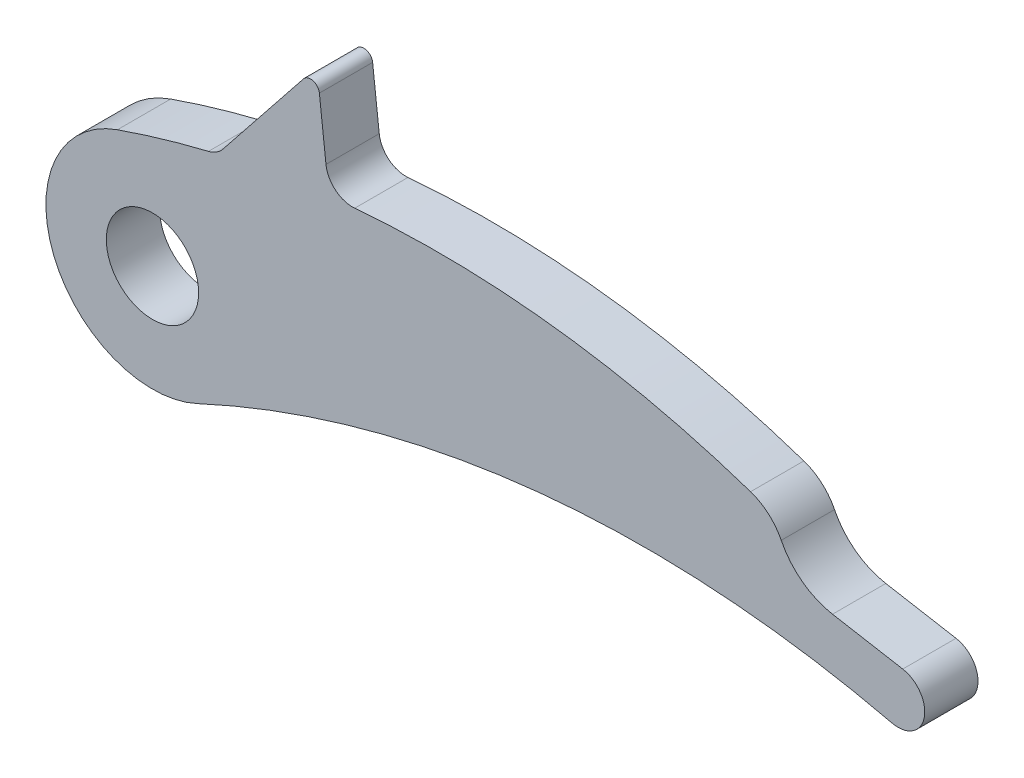
ISO-10303-21;
HEADER;
FILE_DESCRIPTION(('STEP AP214'),'2;1');
FILE_NAME('part.step','',(''),(''),'','','');
FILE_SCHEMA(('AUTOMOTIVE_DESIGN { 1 0 10303 214 1 1 1 1 }'));
ENDSEC;
DATA;
#1=APPLICATION_CONTEXT('core data for automotive mechanical design processes');
#2=APPLICATION_PROTOCOL_DEFINITION('international standard','automotive_design',2000,#1);
#3=PRODUCT_CONTEXT('',#1,'mechanical');
#4=PRODUCT('Part','Part','',(#3));
#5=PRODUCT_RELATED_PRODUCT_CATEGORY('part','',(#4));
#6=PRODUCT_DEFINITION_FORMATION('','',#4);
#7=PRODUCT_DEFINITION_CONTEXT('part definition',#1,'design');
#8=PRODUCT_DEFINITION('design','',#6,#7);
#9=PRODUCT_DEFINITION_SHAPE('','',#8);
#10=(LENGTH_UNIT() NAMED_UNIT(*) SI_UNIT(.MILLI.,.METRE.));
#11=(NAMED_UNIT(*) PLANE_ANGLE_UNIT() SI_UNIT($,.RADIAN.));
#12=(NAMED_UNIT(*) SI_UNIT($,.STERADIAN.) SOLID_ANGLE_UNIT());
#13=UNCERTAINTY_MEASURE_WITH_UNIT(LENGTH_MEASURE(1.E-05),#10,'distance_accuracy_value','');
#14=(GEOMETRIC_REPRESENTATION_CONTEXT(3) GLOBAL_UNCERTAINTY_ASSIGNED_CONTEXT((#13)) GLOBAL_UNIT_ASSIGNED_CONTEXT((#10,
#11,#12)) REPRESENTATION_CONTEXT('',''));
#15=CARTESIAN_POINT('',(0.,0.,0.));
#16=DIRECTION('',(0.,0.,1.));
#17=DIRECTION('',(1.,0.,0.));
#18=AXIS2_PLACEMENT_3D('',#15,#16,#17);
#19=CARTESIAN_POINT('',(8.90518114231674,13.0845857956096,3.));
#20=DIRECTION('',(0.,0.,1.));
#21=DIRECTION('',(1.,0.,0.));
#22=AXIS2_PLACEMENT_3D('',#19,#20,#21);
#23=PLANE('',#22);
#24=CARTESIAN_POINT('',(8.90518114231674,13.0845857956096,3.));
#25=DIRECTION('',(0.,0.,1.));
#26=DIRECTION('',(1.,0.,0.));
#27=AXIS2_PLACEMENT_3D('',#24,#25,#26);
#28=CIRCLE('',#27,0.499999999999999);
#29=CARTESIAN_POINT('',(9.40201950643126,13.1407252642925,3.));
#30=VERTEX_POINT('',#29);
#31=CARTESIAN_POINT('',(8.51416676689983,13.3962069730308,3.));
#32=VERTEX_POINT('',#31);
#33=EDGE_CURVE('E175',#30,#32,#28,.T.);
#34=ORIENTED_EDGE('',*,*,#33,.T.);
#35=DIRECTION('',(-0.623242354842235,-0.78202875083382,0.));
#36=VECTOR('',#35,1.);
#37=CARTESIAN_POINT('',(3.97449738674808,7.69994460097602,3.));
#38=LINE('',#37,#36);
#39=CARTESIAN_POINT('',(3.97449738674808,7.69994460097602,3.));
#40=VERTEX_POINT('',#39);
#41=EDGE_CURVE('E142',#32,#40,#38,.T.);
#42=ORIENTED_EDGE('',*,*,#41,.T.);
#43=CARTESIAN_POINT('',(2.80145426049735,8.63480813323937,3.));
#44=DIRECTION('',(0.,0.,-1.));
#45=DIRECTION('',(-1.,0.,0.));
#46=AXIS2_PLACEMENT_3D('',#43,#44,#45);
#47=CIRCLE('',#46,1.5);
#48=CARTESIAN_POINT('',(3.15492455497266,7.17705000826681,3.));
#49=VERTEX_POINT('',#48);
#50=EDGE_CURVE('E178',#40,#49,#47,.T.);
#51=ORIENTED_EDGE('',*,*,#50,.T.);
#52=CARTESIAN_POINT('',(16.1155020190674,-46.2740812407273,3.));
#53=DIRECTION('',(0.,0.,1.));
#54=DIRECTION('',(-1.,0.,0.));
#55=AXIS2_PLACEMENT_3D('',#52,#53,#54);
#56=CIRCLE('',#55,55.);
#57=CARTESIAN_POINT('',(-1.97332677784499,5.66621402947682,3.));
#58=VERTEX_POINT('',#57);
#59=EDGE_CURVE('E180',#49,#58,#56,.T.);
#60=ORIENTED_EDGE('',*,*,#59,.T.);
#61=CARTESIAN_POINT('',(0.,0.,3.));
#62=DIRECTION('',(0.,0.,1.));
#63=DIRECTION('',(1.,0.,0.));
#64=AXIS2_PLACEMENT_3D('',#61,#62,#63);
#65=CIRCLE('',#64,6.);
#66=CARTESIAN_POINT('',(2.53003246753246,-5.44049039271569,3.));
#67=VERTEX_POINT('',#66);
#68=EDGE_CURVE('E182',#58,#67,#65,.T.);
#69=ORIENTED_EDGE('',*,*,#68,.T.);
#70=CARTESIAN_POINT('',(27.8303571428571,-59.8453943198724,3.));
#71=DIRECTION('',(0.,0.,-1.));
#72=DIRECTION('',(-1.,0.,0.));
#73=AXIS2_PLACEMENT_3D('',#70,#71,#72);
#74=CIRCLE('',#73,60.);
#75=CARTESIAN_POINT('',(41.6543989547038,-1.45964376389933,3.));
#76=VERTEX_POINT('',#75);
#77=EDGE_CURVE('E184',#67,#76,#74,.T.);
#78=ORIENTED_EDGE('',*,*,#77,.T.);
#79=CARTESIAN_POINT('',(42.,0.,3.));
#80=DIRECTION('',(0.,0.,1.));
#81=DIRECTION('',(1.,0.,0.));
#82=AXIS2_PLACEMENT_3D('',#79,#80,#81);
#83=CIRCLE('',#82,1.5);
#84=CARTESIAN_POINT('',(42.2604722665004,1.47721162951831,3.));
#85=VERTEX_POINT('',#84);
#86=EDGE_CURVE('E186',#76,#85,#83,.T.);
#87=ORIENTED_EDGE('',*,*,#86,.T.);
#88=DIRECTION('',(-0.984807753012209,0.173648177666924,0.));
#89=VECTOR('',#88,1.);
#90=CARTESIAN_POINT('',(42.2604722665004,1.47721162951831,3.));
#91=LINE('',#90,#89);
#92=CARTESIAN_POINT('',(38.3054072893323,2.17459629544813,3.));
#93=VERTEX_POINT('',#92);
#94=EDGE_CURVE('E188',#85,#93,#91,.T.);
#95=ORIENTED_EDGE('',*,*,#94,.T.);
#96=CARTESIAN_POINT('',(39.,6.11382730749697,3.));
#97=DIRECTION('',(0.,0.,-1.));
#98=DIRECTION('',(-1.,0.,0.));
#99=AXIS2_PLACEMENT_3D('',#96,#97,#98);
#100=CIRCLE('',#99,4.);
#101=CARTESIAN_POINT('',(35.4175448163922,4.3344974174987,3.));
#102=VERTEX_POINT('',#101);
#103=EDGE_CURVE('E190',#93,#102,#100,.T.);
#104=ORIENTED_EDGE('',*,*,#103,.T.);
#105=CARTESIAN_POINT('',(32.7307034286863,3.,3.));
#106=DIRECTION('',(0.,0.,1.));
#107=DIRECTION('',(1.,0.,0.));
#108=AXIS2_PLACEMENT_3D('',#105,#106,#107);
#109=CIRCLE('',#108,3.);
#110=CARTESIAN_POINT('',(33.6892727407796,5.84273545619581,3.));
#111=VERTEX_POINT('',#110);
#112=EDGE_CURVE('E192',#102,#111,#109,.T.);
#113=ORIENTED_EDGE('',*,*,#112,.T.);
#114=CARTESIAN_POINT('',(16.1155020190674,-46.2740812407273,3.));
#115=DIRECTION('',(0.,0.,1.));
#116=DIRECTION('',(-1.,0.,0.));
#117=AXIS2_PLACEMENT_3D('',#114,#115,#116);
#118=CIRCLE('',#117,55.);
#119=CARTESIAN_POINT('',(11.3932810319799,8.52282222059161,3.));
#120=VERTEX_POINT('',#119);
#121=EDGE_CURVE('E194',#111,#120,#118,.T.);
#122=ORIENTED_EDGE('',*,*,#121,.T.);
#123=CARTESIAN_POINT('',(11.2644931868775,10.0172832240821,3.));
#124=DIRECTION('',(0.,0.,-1.));
#125=DIRECTION('',(-1.,0.,0.));
#126=AXIS2_PLACEMENT_3D('',#123,#124,#125);
#127=CIRCLE('',#126,1.5);
#128=CARTESIAN_POINT('',(9.77397809453392,9.8488648180334,3.));
#129=VERTEX_POINT('',#128);
#130=EDGE_CURVE('E53',#120,#129,#127,.T.);
#131=ORIENTED_EDGE('',*,*,#130,.T.);
#132=DIRECTION('',(-0.112278937365818,0.993676728229057,0.));
#133=VECTOR('',#132,1.);
#134=CARTESIAN_POINT('',(9.40201950643126,13.1407252642925,3.));
#135=LINE('',#134,#133);
#136=EDGE_CURVE('E48',#129,#30,#135,.T.);
#137=ORIENTED_EDGE('',*,*,#136,.T.);
#138=EDGE_LOOP('',(#34,#42,#51,#60,#69,#78,#87,#95,#104,#113,#122,#131,#137));
#139=FACE_BOUND('',#138,.T.);
#140=CARTESIAN_POINT('',(0.,0.,3.));
#141=DIRECTION('',(0.,0.,1.));
#142=DIRECTION('',(1.,0.,0.));
#143=AXIS2_PLACEMENT_3D('',#140,#141,#142);
#144=CIRCLE('',#143,2.6);
#145=CARTESIAN_POINT('',(2.6,0.,3.));
#146=VERTEX_POINT('',#145);
#147=EDGE_CURVE('E147',#146,#146,#144,.T.);
#148=ORIENTED_EDGE('',*,*,#147,.F.);
#149=EDGE_LOOP('',(#148));
#150=FACE_BOUND('',#149,.T.);
#151=ADVANCED_FACE('F33',(#139,#150),#23,.T.);
#152=CARTESIAN_POINT('',(8.90518114231674,13.0845857956096,0.));
#153=DIRECTION('',(0.,0.,1.));
#154=DIRECTION('',(1.,0.,0.));
#155=AXIS2_PLACEMENT_3D('',#152,#153,#154);
#156=PLANE('',#155);
#157=CARTESIAN_POINT('',(8.90518114231674,13.0845857956096,0.));
#158=DIRECTION('',(0.,0.,1.));
#159=DIRECTION('',(1.,0.,0.));
#160=AXIS2_PLACEMENT_3D('',#157,#158,#159);
#161=CIRCLE('',#160,0.499999999999999);
#162=CARTESIAN_POINT('',(9.40201950643126,13.1407252642925,0.));
#163=VERTEX_POINT('',#162);
#164=CARTESIAN_POINT('',(8.51416676689983,13.3962069730308,0.));
#165=VERTEX_POINT('',#164);
#166=EDGE_CURVE('E133',#163,#165,#161,.T.);
#167=ORIENTED_EDGE('',*,*,#166,.F.);
#168=DIRECTION('',(-0.112278937365818,0.993676728229057,0.));
#169=VECTOR('',#168,1.);
#170=CARTESIAN_POINT('',(9.40201950643126,13.1407252642925,0.));
#171=LINE('',#170,#169);
#172=CARTESIAN_POINT('',(9.77397809453392,9.8488648180334,0.));
#173=VERTEX_POINT('',#172);
#174=EDGE_CURVE('E173',#173,#163,#171,.T.);
#175=ORIENTED_EDGE('',*,*,#174,.F.);
#176=CARTESIAN_POINT('',(11.2644931868775,10.0172832240821,0.));
#177=DIRECTION('',(0.,0.,-1.));
#178=DIRECTION('',(-1.,0.,0.));
#179=AXIS2_PLACEMENT_3D('',#176,#177,#178);
#180=CIRCLE('',#179,1.5);
#181=CARTESIAN_POINT('',(11.3932810319799,8.52282222059161,0.));
#182=VERTEX_POINT('',#181);
#183=EDGE_CURVE('E171',#182,#173,#180,.T.);
#184=ORIENTED_EDGE('',*,*,#183,.F.);
#185=CARTESIAN_POINT('',(16.1155020190674,-46.2740812407273,0.));
#186=DIRECTION('',(0.,0.,1.));
#187=DIRECTION('',(-1.,0.,0.));
#188=AXIS2_PLACEMENT_3D('',#185,#186,#187);
#189=CIRCLE('',#188,55.);
#190=CARTESIAN_POINT('',(33.6892727407796,5.84273545619581,0.));
#191=VERTEX_POINT('',#190);
#192=EDGE_CURVE('E169',#191,#182,#189,.T.);
#193=ORIENTED_EDGE('',*,*,#192,.F.);
#194=CARTESIAN_POINT('',(32.7307034286863,3.,0.));
#195=DIRECTION('',(0.,0.,1.));
#196=DIRECTION('',(1.,0.,0.));
#197=AXIS2_PLACEMENT_3D('',#194,#195,#196);
#198=CIRCLE('',#197,3.);
#199=CARTESIAN_POINT('',(35.4175448163922,4.3344974174987,0.));
#200=VERTEX_POINT('',#199);
#201=EDGE_CURVE('E167',#200,#191,#198,.T.);
#202=ORIENTED_EDGE('',*,*,#201,.F.);
#203=CARTESIAN_POINT('',(39.,6.11382730749697,0.));
#204=DIRECTION('',(0.,0.,-1.));
#205=DIRECTION('',(-1.,0.,0.));
#206=AXIS2_PLACEMENT_3D('',#203,#204,#205);
#207=CIRCLE('',#206,4.);
#208=CARTESIAN_POINT('',(38.3054072893323,2.17459629544813,0.));
#209=VERTEX_POINT('',#208);
#210=EDGE_CURVE('E165',#209,#200,#207,.T.);
#211=ORIENTED_EDGE('',*,*,#210,.F.);
#212=DIRECTION('',(-0.984807753012209,0.173648177666924,0.));
#213=VECTOR('',#212,1.);
#214=CARTESIAN_POINT('',(42.2604722665004,1.47721162951831,0.));
#215=LINE('',#214,#213);
#216=CARTESIAN_POINT('',(42.2604722665004,1.47721162951831,0.));
#217=VERTEX_POINT('',#216);
#218=EDGE_CURVE('E163',#217,#209,#215,.T.);
#219=ORIENTED_EDGE('',*,*,#218,.F.);
#220=CARTESIAN_POINT('',(42.,0.,0.));
#221=DIRECTION('',(0.,0.,1.));
#222=DIRECTION('',(1.,0.,0.));
#223=AXIS2_PLACEMENT_3D('',#220,#221,#222);
#224=CIRCLE('',#223,1.5);
#225=CARTESIAN_POINT('',(41.6543989547038,-1.45964376389933,0.));
#226=VERTEX_POINT('',#225);
#227=EDGE_CURVE('E161',#226,#217,#224,.T.);
#228=ORIENTED_EDGE('',*,*,#227,.F.);
#229=CARTESIAN_POINT('',(27.8303571428571,-59.8453943198724,0.));
#230=DIRECTION('',(0.,0.,-1.));
#231=DIRECTION('',(-1.,0.,0.));
#232=AXIS2_PLACEMENT_3D('',#229,#230,#231);
#233=CIRCLE('',#232,60.);
#234=CARTESIAN_POINT('',(2.53003246753246,-5.44049039271569,0.));
#235=VERTEX_POINT('',#234);
#236=EDGE_CURVE('E159',#235,#226,#233,.T.);
#237=ORIENTED_EDGE('',*,*,#236,.F.);
#238=CARTESIAN_POINT('',(0.,0.,0.));
#239=DIRECTION('',(0.,0.,1.));
#240=DIRECTION('',(1.,0.,0.));
#241=AXIS2_PLACEMENT_3D('',#238,#239,#240);
#242=CIRCLE('',#241,6.);
#243=CARTESIAN_POINT('',(-1.97332677784499,5.66621402947682,0.));
#244=VERTEX_POINT('',#243);
#245=EDGE_CURVE('E157',#244,#235,#242,.T.);
#246=ORIENTED_EDGE('',*,*,#245,.F.);
#247=CARTESIAN_POINT('',(16.1155020190674,-46.2740812407273,0.));
#248=DIRECTION('',(0.,0.,1.));
#249=DIRECTION('',(-1.,0.,0.));
#250=AXIS2_PLACEMENT_3D('',#247,#248,#249);
#251=CIRCLE('',#250,55.);
#252=CARTESIAN_POINT('',(3.15492455497266,7.17705000826681,0.));
#253=VERTEX_POINT('',#252);
#254=EDGE_CURVE('E155',#253,#244,#251,.T.);
#255=ORIENTED_EDGE('',*,*,#254,.F.);
#256=CARTESIAN_POINT('',(2.80145426049735,8.63480813323937,0.));
#257=DIRECTION('',(0.,0.,-1.));
#258=DIRECTION('',(-1.,0.,0.));
#259=AXIS2_PLACEMENT_3D('',#256,#257,#258);
#260=CIRCLE('',#259,1.5);
#261=CARTESIAN_POINT('',(3.97449738674808,7.69994460097602,0.));
#262=VERTEX_POINT('',#261);
#263=EDGE_CURVE('E135',#262,#253,#260,.T.);
#264=ORIENTED_EDGE('',*,*,#263,.F.);
#265=DIRECTION('',(-0.623242354842235,-0.78202875083382,0.));
#266=VECTOR('',#265,1.);
#267=CARTESIAN_POINT('',(3.97449738674808,7.69994460097602,0.));
#268=LINE('',#267,#266);
#269=EDGE_CURVE('E128',#165,#262,#268,.T.);
#270=ORIENTED_EDGE('',*,*,#269,.F.);
#271=EDGE_LOOP('',(#167,#175,#184,#193,#202,#211,#219,#228,#237,#246,#255,#264,#270));
#272=FACE_BOUND('',#271,.T.);
#273=CARTESIAN_POINT('',(0.,0.,0.));
#274=DIRECTION('',(0.,0.,1.));
#275=DIRECTION('',(1.,0.,0.));
#276=AXIS2_PLACEMENT_3D('',#273,#274,#275);
#277=CIRCLE('',#276,2.6);
#278=CARTESIAN_POINT('',(2.6,0.,0.));
#279=VERTEX_POINT('',#278);
#280=EDGE_CURVE('E150',#279,#279,#277,.T.);
#281=ORIENTED_EDGE('',*,*,#280,.T.);
#282=EDGE_LOOP('',(#281));
#283=FACE_BOUND('',#282,.T.);
#284=ADVANCED_FACE('F129',(#272,#283),#156,.F.);
#285=CARTESIAN_POINT('',(8.90518114231674,13.0845857956096,3.));
#286=DIRECTION('',(0.,0.,-1.));
#287=DIRECTION('',(-1.,0.,0.));
#288=AXIS2_PLACEMENT_3D('',#285,#286,#287);
#289=CYLINDRICAL_SURFACE('',#288,0.499999999999999);
#290=ORIENTED_EDGE('',*,*,#166,.T.);
#291=DIRECTION('',(0.,0.,-1.));
#292=VECTOR('',#291,1.);
#293=CARTESIAN_POINT('',(8.51416676689983,13.3962069730308,3.));
#294=LINE('',#293,#292);
#295=EDGE_CURVE('E11',#32,#165,#294,.T.);
#296=ORIENTED_EDGE('',*,*,#295,.F.);
#297=ORIENTED_EDGE('',*,*,#33,.F.);
#298=DIRECTION('',(0.,0.,-1.));
#299=VECTOR('',#298,1.);
#300=CARTESIAN_POINT('',(9.40201950643126,13.1407252642925,3.));
#301=LINE('',#300,#299);
#302=EDGE_CURVE('E146',#30,#163,#301,.T.);
#303=ORIENTED_EDGE('',*,*,#302,.T.);
#304=EDGE_LOOP('',(#290,#296,#297,#303));
#305=FACE_BOUND('',#304,.T.);
#306=ADVANCED_FACE('F35',(#305),#289,.T.);
#307=CARTESIAN_POINT('',(3.97449738674808,7.69994460097602,3.));
#308=DIRECTION('',(0.78202875083382,-0.623242354842236,0.));
#309=DIRECTION('',(0.623242354842236,0.78202875083382,0.));
#310=AXIS2_PLACEMENT_3D('',#307,#308,#309);
#311=PLANE('',#310);
#312=ORIENTED_EDGE('',*,*,#269,.T.);
#313=DIRECTION('',(0.,0.,-1.));
#314=VECTOR('',#313,1.);
#315=CARTESIAN_POINT('',(3.97449738674808,7.69994460097602,3.));
#316=LINE('',#315,#314);
#317=EDGE_CURVE('E41',#40,#262,#316,.T.);
#318=ORIENTED_EDGE('',*,*,#317,.F.);
#319=ORIENTED_EDGE('',*,*,#41,.F.);
#320=ORIENTED_EDGE('',*,*,#295,.T.);
#321=EDGE_LOOP('',(#312,#318,#319,#320));
#322=FACE_BOUND('',#321,.T.);
#323=ADVANCED_FACE('F141',(#322),#311,.F.);
#324=CARTESIAN_POINT('',(2.80145426049735,8.63480813323937,3.));
#325=DIRECTION('',(0.,0.,-1.));
#326=DIRECTION('',(-1.,0.,0.));
#327=AXIS2_PLACEMENT_3D('',#324,#325,#326);
#328=CYLINDRICAL_SURFACE('',#327,1.5);
#329=ORIENTED_EDGE('',*,*,#263,.T.);
#330=DIRECTION('',(0.,0.,-1.));
#331=VECTOR('',#330,1.);
#332=CARTESIAN_POINT('',(3.15492455497266,7.17705000826681,3.));
#333=LINE('',#332,#331);
#334=EDGE_CURVE('E226',#49,#253,#333,.T.);
#335=ORIENTED_EDGE('',*,*,#334,.F.);
#336=ORIENTED_EDGE('',*,*,#50,.F.);
#337=ORIENTED_EDGE('',*,*,#317,.T.);
#338=EDGE_LOOP('',(#329,#335,#336,#337));
#339=FACE_BOUND('',#338,.T.);
#340=ADVANCED_FACE('F230',(#339),#328,.F.);
#341=CARTESIAN_POINT('',(16.1155020190674,-46.2740812407273,3.));
#342=DIRECTION('',(0.,0.,-1.));
#343=DIRECTION('',(-1.,0.,0.));
#344=AXIS2_PLACEMENT_3D('',#341,#342,#343);
#345=CYLINDRICAL_SURFACE('',#344,55.);
#346=ORIENTED_EDGE('',*,*,#254,.T.);
#347=DIRECTION('',(0.,0.,-1.));
#348=VECTOR('',#347,1.);
#349=CARTESIAN_POINT('',(-1.97332677784499,5.66621402947682,3.));
#350=LINE('',#349,#348);
#351=EDGE_CURVE('E223',#58,#244,#350,.T.);
#352=ORIENTED_EDGE('',*,*,#351,.F.);
#353=ORIENTED_EDGE('',*,*,#59,.F.);
#354=ORIENTED_EDGE('',*,*,#334,.T.);
#355=EDGE_LOOP('',(#346,#352,#353,#354));
#356=FACE_BOUND('',#355,.T.);
#357=ADVANCED_FACE('F238',(#356),#345,.T.);
#358=CARTESIAN_POINT('',(0.,0.,3.));
#359=DIRECTION('',(0.,0.,-1.));
#360=DIRECTION('',(-1.,0.,0.));
#361=AXIS2_PLACEMENT_3D('',#358,#359,#360);
#362=CYLINDRICAL_SURFACE('',#361,6.);
#363=ORIENTED_EDGE('',*,*,#245,.T.);
#364=DIRECTION('',(0.,0.,-1.));
#365=VECTOR('',#364,1.);
#366=CARTESIAN_POINT('',(2.53003246753246,-5.44049039271569,3.));
#367=LINE('',#366,#365);
#368=EDGE_CURVE('E220',#67,#235,#367,.T.);
#369=ORIENTED_EDGE('',*,*,#368,.F.);
#370=ORIENTED_EDGE('',*,*,#68,.F.);
#371=ORIENTED_EDGE('',*,*,#351,.T.);
#372=EDGE_LOOP('',(#363,#369,#370,#371));
#373=FACE_BOUND('',#372,.T.);
#374=ADVANCED_FACE('F241',(#373),#362,.T.);
#375=CARTESIAN_POINT('',(27.8303571428571,-59.8453943198724,3.));
#376=DIRECTION('',(0.,0.,-1.));
#377=DIRECTION('',(-1.,0.,0.));
#378=AXIS2_PLACEMENT_3D('',#375,#376,#377);
#379=CYLINDRICAL_SURFACE('',#378,60.);
#380=ORIENTED_EDGE('',*,*,#236,.T.);
#381=DIRECTION('',(0.,0.,-1.));
#382=VECTOR('',#381,1.);
#383=CARTESIAN_POINT('',(41.6543989547038,-1.45964376389933,3.));
#384=LINE('',#383,#382);
#385=EDGE_CURVE('E217',#76,#226,#384,.T.);
#386=ORIENTED_EDGE('',*,*,#385,.F.);
#387=ORIENTED_EDGE('',*,*,#77,.F.);
#388=ORIENTED_EDGE('',*,*,#368,.T.);
#389=EDGE_LOOP('',(#380,#386,#387,#388));
#390=FACE_BOUND('',#389,.T.);
#391=ADVANCED_FACE('F246',(#390),#379,.F.);
#392=CARTESIAN_POINT('',(42.,0.,3.));
#393=DIRECTION('',(0.,0.,-1.));
#394=DIRECTION('',(-1.,0.,0.));
#395=AXIS2_PLACEMENT_3D('',#392,#393,#394);
#396=CYLINDRICAL_SURFACE('',#395,1.5);
#397=ORIENTED_EDGE('',*,*,#227,.T.);
#398=DIRECTION('',(0.,0.,-1.));
#399=VECTOR('',#398,1.);
#400=CARTESIAN_POINT('',(42.2604722665004,1.47721162951831,3.));
#401=LINE('',#400,#399);
#402=EDGE_CURVE('E214',#85,#217,#401,.T.);
#403=ORIENTED_EDGE('',*,*,#402,.F.);
#404=ORIENTED_EDGE('',*,*,#86,.F.);
#405=ORIENTED_EDGE('',*,*,#385,.T.);
#406=EDGE_LOOP('',(#397,#403,#404,#405));
#407=FACE_BOUND('',#406,.T.);
#408=ADVANCED_FACE('F252',(#407),#396,.T.);
#409=CARTESIAN_POINT('',(42.2604722665004,1.47721162951831,3.));
#410=DIRECTION('',(-0.173648177666924,-0.984807753012209,0.));
#411=DIRECTION('',(0.984807753012209,-0.173648177666924,0.));
#412=AXIS2_PLACEMENT_3D('',#409,#410,#411);
#413=PLANE('',#412);
#414=ORIENTED_EDGE('',*,*,#218,.T.);
#415=DIRECTION('',(0.,0.,-1.));
#416=VECTOR('',#415,1.);
#417=CARTESIAN_POINT('',(38.3054072893323,2.17459629544813,3.));
#418=LINE('',#417,#416);
#419=EDGE_CURVE('E211',#93,#209,#418,.T.);
#420=ORIENTED_EDGE('',*,*,#419,.F.);
#421=ORIENTED_EDGE('',*,*,#94,.F.);
#422=ORIENTED_EDGE('',*,*,#402,.T.);
#423=EDGE_LOOP('',(#414,#420,#421,#422));
#424=FACE_BOUND('',#423,.T.);
#425=ADVANCED_FACE('F256',(#424),#413,.F.);
#426=CARTESIAN_POINT('',(39.,6.11382730749697,3.));
#427=DIRECTION('',(0.,0.,-1.));
#428=DIRECTION('',(-1.,0.,0.));
#429=AXIS2_PLACEMENT_3D('',#426,#427,#428);
#430=CYLINDRICAL_SURFACE('',#429,4.);
#431=ORIENTED_EDGE('',*,*,#210,.T.);
#432=DIRECTION('',(0.,0.,-1.));
#433=VECTOR('',#432,1.);
#434=CARTESIAN_POINT('',(35.4175448163922,4.3344974174987,3.));
#435=LINE('',#434,#433);
#436=EDGE_CURVE('E208',#102,#200,#435,.T.);
#437=ORIENTED_EDGE('',*,*,#436,.F.);
#438=ORIENTED_EDGE('',*,*,#103,.F.);
#439=ORIENTED_EDGE('',*,*,#419,.T.);
#440=EDGE_LOOP('',(#431,#437,#438,#439));
#441=FACE_BOUND('',#440,.T.);
#442=ADVANCED_FACE('F261',(#441),#430,.F.);
#443=CARTESIAN_POINT('',(32.7307034286863,3.,3.));
#444=DIRECTION('',(0.,0.,-1.));
#445=DIRECTION('',(-1.,0.,0.));
#446=AXIS2_PLACEMENT_3D('',#443,#444,#445);
#447=CYLINDRICAL_SURFACE('',#446,3.);
#448=ORIENTED_EDGE('',*,*,#201,.T.);
#449=DIRECTION('',(0.,0.,-1.));
#450=VECTOR('',#449,1.);
#451=CARTESIAN_POINT('',(33.6892727407796,5.84273545619581,3.));
#452=LINE('',#451,#450);
#453=EDGE_CURVE('E205',#111,#191,#452,.T.);
#454=ORIENTED_EDGE('',*,*,#453,.F.);
#455=ORIENTED_EDGE('',*,*,#112,.F.);
#456=ORIENTED_EDGE('',*,*,#436,.T.);
#457=EDGE_LOOP('',(#448,#454,#455,#456));
#458=FACE_BOUND('',#457,.T.);
#459=ADVANCED_FACE('F267',(#458),#447,.T.);
#460=CARTESIAN_POINT('',(16.1155020190674,-46.2740812407273,3.));
#461=DIRECTION('',(0.,0.,-1.));
#462=DIRECTION('',(-1.,0.,0.));
#463=AXIS2_PLACEMENT_3D('',#460,#461,#462);
#464=CYLINDRICAL_SURFACE('',#463,55.);
#465=ORIENTED_EDGE('',*,*,#192,.T.);
#466=DIRECTION('',(0.,0.,-1.));
#467=VECTOR('',#466,1.);
#468=CARTESIAN_POINT('',(11.3932810319799,8.52282222059161,3.));
#469=LINE('',#468,#467);
#470=EDGE_CURVE('E202',#120,#182,#469,.T.);
#471=ORIENTED_EDGE('',*,*,#470,.F.);
#472=ORIENTED_EDGE('',*,*,#121,.F.);
#473=ORIENTED_EDGE('',*,*,#453,.T.);
#474=EDGE_LOOP('',(#465,#471,#472,#473));
#475=FACE_BOUND('',#474,.T.);
#476=ADVANCED_FACE('F271',(#475),#464,.T.);
#477=CARTESIAN_POINT('',(11.2644931868775,10.0172832240821,3.));
#478=DIRECTION('',(0.,0.,-1.));
#479=DIRECTION('',(-1.,0.,0.));
#480=AXIS2_PLACEMENT_3D('',#477,#478,#479);
#481=CYLINDRICAL_SURFACE('',#480,1.5);
#482=ORIENTED_EDGE('',*,*,#183,.T.);
#483=DIRECTION('',(0.,0.,-1.));
#484=VECTOR('',#483,1.);
#485=CARTESIAN_POINT('',(9.77397809453392,9.8488648180334,3.));
#486=LINE('',#485,#484);
#487=EDGE_CURVE('E199',#129,#173,#486,.T.);
#488=ORIENTED_EDGE('',*,*,#487,.F.);
#489=ORIENTED_EDGE('',*,*,#130,.F.);
#490=ORIENTED_EDGE('',*,*,#470,.T.);
#491=EDGE_LOOP('',(#482,#488,#489,#490));
#492=FACE_BOUND('',#491,.T.);
#493=ADVANCED_FACE('F274',(#492),#481,.F.);
#494=CARTESIAN_POINT('',(9.40201950643126,13.1407252642925,3.));
#495=DIRECTION('',(-0.993676728229057,-0.112278937365817,0.));
#496=DIRECTION('',(0.112278937365818,-0.993676728229057,0.));
#497=AXIS2_PLACEMENT_3D('',#494,#495,#496);
#498=PLANE('',#497);
#499=ORIENTED_EDGE('',*,*,#174,.T.);
#500=ORIENTED_EDGE('',*,*,#302,.F.);
#501=ORIENTED_EDGE('',*,*,#136,.F.);
#502=ORIENTED_EDGE('',*,*,#487,.T.);
#503=EDGE_LOOP('',(#499,#500,#501,#502));
#504=FACE_BOUND('',#503,.T.);
#505=ADVANCED_FACE('F276',(#504),#498,.F.);
#506=CARTESIAN_POINT('',(0.,0.,3.));
#507=DIRECTION('',(0.,0.,-1.));
#508=DIRECTION('',(-1.,0.,0.));
#509=AXIS2_PLACEMENT_3D('',#506,#507,#508);
#510=CYLINDRICAL_SURFACE('',#509,2.6);
#511=ORIENTED_EDGE('',*,*,#147,.T.);
#512=EDGE_LOOP('',(#511));
#513=FACE_BOUND('',#512,.T.);
#514=ORIENTED_EDGE('',*,*,#280,.F.);
#515=EDGE_LOOP('',(#514));
#516=FACE_BOUND('',#515,.T.);
#517=ADVANCED_FACE('F278',(#513,#516),#510,.F.);
#518=CLOSED_SHELL('',(#151,#284,#306,#323,#340,#357,#374,#391,#408,#425,#442,#459,#476,#493,
#505,#517));
#519=MANIFOLD_SOLID_BREP('B2',#518);
#520=ADVANCED_BREP_SHAPE_REPRESENTATION('',(#18,#519),#14);
#521=SHAPE_DEFINITION_REPRESENTATION(#9,#520);
ENDSEC;
END-ISO-10303-21;
